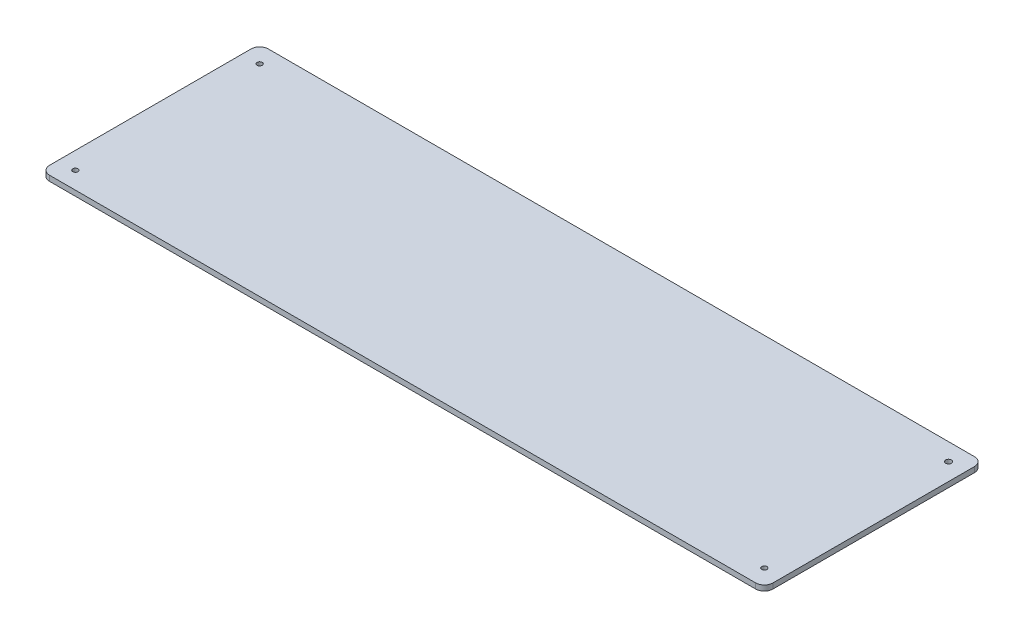
ISO-10303-21;
HEADER;
FILE_DESCRIPTION(('STEP AP214'),'2;1');
FILE_NAME('part.step','',(''),(''),'','','');
FILE_SCHEMA(('AUTOMOTIVE_DESIGN { 1 0 10303 214 1 1 1 1 }'));
ENDSEC;
DATA;
#1=APPLICATION_CONTEXT('core data for automotive mechanical design processes');
#2=APPLICATION_PROTOCOL_DEFINITION('international standard','automotive_design',2000,#1);
#3=PRODUCT_CONTEXT('',#1,'mechanical');
#4=PRODUCT('Part','Part','',(#3));
#5=PRODUCT_RELATED_PRODUCT_CATEGORY('part','',(#4));
#6=PRODUCT_DEFINITION_FORMATION('','',#4);
#7=PRODUCT_DEFINITION_CONTEXT('part definition',#1,'design');
#8=PRODUCT_DEFINITION('design','',#6,#7);
#9=PRODUCT_DEFINITION_SHAPE('','',#8);
#10=(LENGTH_UNIT() NAMED_UNIT(*) SI_UNIT(.MILLI.,.METRE.));
#11=(NAMED_UNIT(*) PLANE_ANGLE_UNIT() SI_UNIT($,.RADIAN.));
#12=(NAMED_UNIT(*) SI_UNIT($,.STERADIAN.) SOLID_ANGLE_UNIT());
#13=UNCERTAINTY_MEASURE_WITH_UNIT(LENGTH_MEASURE(1.E-05),#10,'distance_accuracy_value','');
#14=(GEOMETRIC_REPRESENTATION_CONTEXT(3) GLOBAL_UNCERTAINTY_ASSIGNED_CONTEXT((#13)) GLOBAL_UNIT_ASSIGNED_CONTEXT((#10,
#11,#12)) REPRESENTATION_CONTEXT('',''));
#15=CARTESIAN_POINT('',(0.,0.,0.));
#16=DIRECTION('',(0.,0.,1.));
#17=DIRECTION('',(1.,0.,0.));
#18=AXIS2_PLACEMENT_3D('',#15,#16,#17);
#19=CARTESIAN_POINT('',(210.,3.1,63.5));
#20=DIRECTION('',(-1.,0.,0.));
#21=DIRECTION('',(0.,0.,1.));
#22=AXIS2_PLACEMENT_3D('',#19,#20,#21);
#23=PLANE('',#22);
#24=DIRECTION('',(0.,0.,-1.));
#25=VECTOR('',#24,1.);
#26=CARTESIAN_POINT('',(210.,0.,63.5));
#27=LINE('',#26,#25);
#28=CARTESIAN_POINT('',(210.,0.,58.5));
#29=VERTEX_POINT('',#28);
#30=CARTESIAN_POINT('',(210.,0.,-58.5));
#31=VERTEX_POINT('',#30);
#32=EDGE_CURVE('E127',#29,#31,#27,.T.);
#33=ORIENTED_EDGE('',*,*,#32,.T.);
#34=DIRECTION('',(0.,-1.,0.));
#35=VECTOR('',#34,1.);
#36=CARTESIAN_POINT('',(210.,3.1,-58.5));
#37=LINE('',#36,#35);
#38=CARTESIAN_POINT('',(210.,3.1,-58.5));
#39=VERTEX_POINT('',#38);
#40=EDGE_CURVE('E104',#31,#39,#37,.F.);
#41=ORIENTED_EDGE('',*,*,#40,.T.);
#42=DIRECTION('',(0.,0.,-1.));
#43=VECTOR('',#42,1.);
#44=CARTESIAN_POINT('',(210.,3.1,63.5));
#45=LINE('',#44,#43);
#46=CARTESIAN_POINT('',(210.,3.1,58.5));
#47=VERTEX_POINT('',#46);
#48=EDGE_CURVE('E137',#47,#39,#45,.T.);
#49=ORIENTED_EDGE('',*,*,#48,.F.);
#50=DIRECTION('',(0.,-1.,0.));
#51=VECTOR('',#50,1.);
#52=CARTESIAN_POINT('',(210.,3.1,58.5));
#53=LINE('',#52,#51);
#54=EDGE_CURVE('E109',#47,#29,#53,.T.);
#55=ORIENTED_EDGE('',*,*,#54,.T.);
#56=EDGE_LOOP('',(#33,#41,#49,#55));
#57=FACE_BOUND('',#56,.T.);
#58=ADVANCED_FACE('F32',(#57),#23,.F.);
#59=CARTESIAN_POINT('',(-210.,3.1,-63.5));
#60=DIRECTION('',(0.,0.,1.));
#61=DIRECTION('',(1.,0.,0.));
#62=AXIS2_PLACEMENT_3D('',#59,#60,#61);
#63=PLANE('',#62);
#64=DIRECTION('',(-1.,0.,0.));
#65=VECTOR('',#64,1.);
#66=CARTESIAN_POINT('',(-210.,3.1,-63.5));
#67=LINE('',#66,#65);
#68=CARTESIAN_POINT('',(205.,3.1,-63.5));
#69=VERTEX_POINT('',#68);
#70=CARTESIAN_POINT('',(-205.,3.1,-63.5));
#71=VERTEX_POINT('',#70);
#72=EDGE_CURVE('E119',#69,#71,#67,.T.);
#73=ORIENTED_EDGE('',*,*,#72,.F.);
#74=DIRECTION('',(0.,-1.,0.));
#75=VECTOR('',#74,1.);
#76=CARTESIAN_POINT('',(205.,3.1,-63.5));
#77=LINE('',#76,#75);
#78=CARTESIAN_POINT('',(205.,0.,-63.5));
#79=VERTEX_POINT('',#78);
#80=EDGE_CURVE('E103',#69,#79,#77,.T.);
#81=ORIENTED_EDGE('',*,*,#80,.T.);
#82=DIRECTION('',(-1.,0.,0.));
#83=VECTOR('',#82,1.);
#84=CARTESIAN_POINT('',(-210.,0.,-63.5));
#85=LINE('',#84,#83);
#86=CARTESIAN_POINT('',(-205.,0.,-63.5));
#87=VERTEX_POINT('',#86);
#88=EDGE_CURVE('E116',#79,#87,#85,.T.);
#89=ORIENTED_EDGE('',*,*,#88,.T.);
#90=DIRECTION('',(0.,-1.,0.));
#91=VECTOR('',#90,1.);
#92=CARTESIAN_POINT('',(-205.,3.1,-63.5));
#93=LINE('',#92,#91);
#94=EDGE_CURVE('E121',#87,#71,#93,.F.);
#95=ORIENTED_EDGE('',*,*,#94,.T.);
#96=EDGE_LOOP('',(#73,#81,#89,#95));
#97=FACE_BOUND('',#96,.T.);
#98=ADVANCED_FACE('F115',(#97),#63,.F.);
#99=CARTESIAN_POINT('',(-210.,3.1,63.5));
#100=DIRECTION('',(1.,0.,0.));
#101=DIRECTION('',(0.,0.,-1.));
#102=AXIS2_PLACEMENT_3D('',#99,#100,#101);
#103=PLANE('',#102);
#104=DIRECTION('',(0.,0.,1.));
#105=VECTOR('',#104,1.);
#106=CARTESIAN_POINT('',(-210.,3.1,63.5));
#107=LINE('',#106,#105);
#108=CARTESIAN_POINT('',(-210.,3.1,-58.5));
#109=VERTEX_POINT('',#108);
#110=CARTESIAN_POINT('',(-210.,3.1,58.5));
#111=VERTEX_POINT('',#110);
#112=EDGE_CURVE('E160',#109,#111,#107,.T.);
#113=ORIENTED_EDGE('',*,*,#112,.F.);
#114=DIRECTION('',(0.,-1.,0.));
#115=VECTOR('',#114,1.);
#116=CARTESIAN_POINT('',(-210.,3.1,-58.5));
#117=LINE('',#116,#115);
#118=CARTESIAN_POINT('',(-210.,0.,-58.5));
#119=VERTEX_POINT('',#118);
#120=EDGE_CURVE('E11',#109,#119,#117,.T.);
#121=ORIENTED_EDGE('',*,*,#120,.T.);
#122=DIRECTION('',(0.,0.,1.));
#123=VECTOR('',#122,1.);
#124=CARTESIAN_POINT('',(-210.,0.,63.5));
#125=LINE('',#124,#123);
#126=CARTESIAN_POINT('',(-210.,0.,58.5));
#127=VERTEX_POINT('',#126);
#128=EDGE_CURVE('E126',#119,#127,#125,.T.);
#129=ORIENTED_EDGE('',*,*,#128,.T.);
#130=DIRECTION('',(0.,-1.,0.));
#131=VECTOR('',#130,1.);
#132=CARTESIAN_POINT('',(-210.,3.1,58.5));
#133=LINE('',#132,#131);
#134=EDGE_CURVE('E40',#127,#111,#133,.F.);
#135=ORIENTED_EDGE('',*,*,#134,.T.);
#136=EDGE_LOOP('',(#113,#121,#129,#135));
#137=FACE_BOUND('',#136,.T.);
#138=ADVANCED_FACE('F159',(#137),#103,.F.);
#139=CARTESIAN_POINT('',(-210.,3.1,63.5));
#140=DIRECTION('',(0.,0.,-1.));
#141=DIRECTION('',(-1.,0.,0.));
#142=AXIS2_PLACEMENT_3D('',#139,#140,#141);
#143=PLANE('',#142);
#144=DIRECTION('',(1.,0.,0.));
#145=VECTOR('',#144,1.);
#146=CARTESIAN_POINT('',(-210.,0.,63.5));
#147=LINE('',#146,#145);
#148=CARTESIAN_POINT('',(-205.,0.,63.5));
#149=VERTEX_POINT('',#148);
#150=CARTESIAN_POINT('',(205.,0.,63.5));
#151=VERTEX_POINT('',#150);
#152=EDGE_CURVE('E130',#149,#151,#147,.T.);
#153=ORIENTED_EDGE('',*,*,#152,.T.);
#154=DIRECTION('',(0.,-1.,0.));
#155=VECTOR('',#154,1.);
#156=CARTESIAN_POINT('',(205.,3.1,63.5));
#157=LINE('',#156,#155);
#158=CARTESIAN_POINT('',(205.,3.1,63.5));
#159=VERTEX_POINT('',#158);
#160=EDGE_CURVE('E47',#151,#159,#157,.F.);
#161=ORIENTED_EDGE('',*,*,#160,.T.);
#162=DIRECTION('',(1.,0.,0.));
#163=VECTOR('',#162,1.);
#164=CARTESIAN_POINT('',(-210.,3.1,63.5));
#165=LINE('',#164,#163);
#166=CARTESIAN_POINT('',(-205.,3.1,63.5));
#167=VERTEX_POINT('',#166);
#168=EDGE_CURVE('E138',#167,#159,#165,.T.);
#169=ORIENTED_EDGE('',*,*,#168,.F.);
#170=DIRECTION('',(0.,-1.,0.));
#171=VECTOR('',#170,1.);
#172=CARTESIAN_POINT('',(-205.,3.1,63.5));
#173=LINE('',#172,#171);
#174=EDGE_CURVE('E153',#167,#149,#173,.T.);
#175=ORIENTED_EDGE('',*,*,#174,.T.);
#176=EDGE_LOOP('',(#153,#161,#169,#175));
#177=FACE_BOUND('',#176,.T.);
#178=ADVANCED_FACE('F169',(#177),#143,.F.);
#179=CARTESIAN_POINT('',(0.,3.1,0.));
#180=DIRECTION('',(0.,-1.,0.));
#181=DIRECTION('',(0.,0.,-1.));
#182=AXIS2_PLACEMENT_3D('',#179,#180,#181);
#183=PLANE('',#182);
#184=CARTESIAN_POINT('',(-200.,3.1,53.5));
#185=DIRECTION('',(0.,1.,0.));
#186=DIRECTION('',(0.,0.,1.));
#187=AXIS2_PLACEMENT_3D('',#184,#185,#186);
#188=CIRCLE('',#187,1.5);
#189=CARTESIAN_POINT('',(-200.,3.1,55.));
#190=VERTEX_POINT('',#189);
#191=EDGE_CURVE('E197',#190,#190,#188,.T.);
#192=ORIENTED_EDGE('',*,*,#191,.F.);
#193=EDGE_LOOP('',(#192));
#194=FACE_BOUND('',#193,.T.);
#195=CARTESIAN_POINT('',(200.,3.1,-53.5));
#196=DIRECTION('',(0.,1.,0.));
#197=DIRECTION('',(0.,0.,1.));
#198=AXIS2_PLACEMENT_3D('',#195,#196,#197);
#199=CIRCLE('',#198,1.68611487966267);
#200=CARTESIAN_POINT('',(200.,3.1,-51.8138851203373));
#201=VERTEX_POINT('',#200);
#202=EDGE_CURVE('E191',#201,#201,#199,.T.);
#203=ORIENTED_EDGE('',*,*,#202,.F.);
#204=EDGE_LOOP('',(#203));
#205=FACE_BOUND('',#204,.T.);
#206=CARTESIAN_POINT('',(200.,3.1,53.5));
#207=DIRECTION('',(0.,1.,0.));
#208=DIRECTION('',(0.,0.,1.));
#209=AXIS2_PLACEMENT_3D('',#206,#207,#208);
#210=CIRCLE('',#209,1.5);
#211=CARTESIAN_POINT('',(200.,3.1,55.));
#212=VERTEX_POINT('',#211);
#213=EDGE_CURVE('E185',#212,#212,#210,.T.);
#214=ORIENTED_EDGE('',*,*,#213,.F.);
#215=EDGE_LOOP('',(#214));
#216=FACE_BOUND('',#215,.T.);
#217=CARTESIAN_POINT('',(-200.,3.1,-53.5));
#218=DIRECTION('',(0.,1.,0.));
#219=DIRECTION('',(0.,0.,1.));
#220=AXIS2_PLACEMENT_3D('',#217,#218,#219);
#221=CIRCLE('',#220,1.5);
#222=CARTESIAN_POINT('',(-200.,3.1,-52.));
#223=VERTEX_POINT('',#222);
#224=EDGE_CURVE('E179',#223,#223,#221,.T.);
#225=ORIENTED_EDGE('',*,*,#224,.F.);
#226=EDGE_LOOP('',(#225));
#227=FACE_BOUND('',#226,.T.);
#228=ORIENTED_EDGE('',*,*,#48,.T.);
#229=CARTESIAN_POINT('',(205.,3.1,-58.5));
#230=DIRECTION('',(0.,-1.,0.));
#231=DIRECTION('',(0.,0.,-1.));
#232=AXIS2_PLACEMENT_3D('',#229,#230,#231);
#233=CIRCLE('',#232,5.);
#234=EDGE_CURVE('E151',#39,#69,#233,.F.);
#235=ORIENTED_EDGE('',*,*,#234,.T.);
#236=ORIENTED_EDGE('',*,*,#72,.T.);
#237=CARTESIAN_POINT('',(-205.,3.1,-58.5));
#238=DIRECTION('',(0.,-1.,0.));
#239=DIRECTION('',(0.,0.,-1.));
#240=AXIS2_PLACEMENT_3D('',#237,#238,#239);
#241=CIRCLE('',#240,5.);
#242=EDGE_CURVE('E147',#71,#109,#241,.F.);
#243=ORIENTED_EDGE('',*,*,#242,.T.);
#244=ORIENTED_EDGE('',*,*,#112,.T.);
#245=CARTESIAN_POINT('',(-205.,3.1,58.5));
#246=DIRECTION('',(0.,-1.,0.));
#247=DIRECTION('',(0.,0.,-1.));
#248=AXIS2_PLACEMENT_3D('',#245,#246,#247);
#249=CIRCLE('',#248,5.);
#250=EDGE_CURVE('E54',#111,#167,#249,.F.);
#251=ORIENTED_EDGE('',*,*,#250,.T.);
#252=ORIENTED_EDGE('',*,*,#168,.T.);
#253=CARTESIAN_POINT('',(205.,3.1,58.5));
#254=DIRECTION('',(0.,-1.,0.));
#255=DIRECTION('',(0.,0.,-1.));
#256=AXIS2_PLACEMENT_3D('',#253,#254,#255);
#257=CIRCLE('',#256,5.);
#258=EDGE_CURVE('E149',#159,#47,#257,.F.);
#259=ORIENTED_EDGE('',*,*,#258,.T.);
#260=EDGE_LOOP('',(#228,#235,#236,#243,#244,#251,#252,#259));
#261=FACE_BOUND('',#260,.T.);
#262=ADVANCED_FACE('F164',(#194,#205,#216,#227,#261),#183,.F.);
#263=CARTESIAN_POINT('',(0.,0.,0.));
#264=DIRECTION('',(0.,-1.,0.));
#265=DIRECTION('',(0.,0.,-1.));
#266=AXIS2_PLACEMENT_3D('',#263,#264,#265);
#267=PLANE('',#266);
#268=CARTESIAN_POINT('',(-200.,0.,53.5));
#269=DIRECTION('',(0.,1.,0.));
#270=DIRECTION('',(0.,0.,1.));
#271=AXIS2_PLACEMENT_3D('',#268,#269,#270);
#272=CIRCLE('',#271,1.5);
#273=CARTESIAN_POINT('',(-200.,0.,55.));
#274=VERTEX_POINT('',#273);
#275=EDGE_CURVE('E182',#274,#274,#272,.T.);
#276=ORIENTED_EDGE('',*,*,#275,.T.);
#277=EDGE_LOOP('',(#276));
#278=FACE_BOUND('',#277,.T.);
#279=CARTESIAN_POINT('',(200.,0.,-53.5));
#280=DIRECTION('',(0.,1.,0.));
#281=DIRECTION('',(0.,0.,1.));
#282=AXIS2_PLACEMENT_3D('',#279,#280,#281);
#283=CIRCLE('',#282,1.68611487966267);
#284=CARTESIAN_POINT('',(200.,0.,-51.8138851203373));
#285=VERTEX_POINT('',#284);
#286=EDGE_CURVE('E194',#285,#285,#283,.T.);
#287=ORIENTED_EDGE('',*,*,#286,.T.);
#288=EDGE_LOOP('',(#287));
#289=FACE_BOUND('',#288,.T.);
#290=CARTESIAN_POINT('',(200.,0.,53.5));
#291=DIRECTION('',(0.,1.,0.));
#292=DIRECTION('',(0.,0.,1.));
#293=AXIS2_PLACEMENT_3D('',#290,#291,#292);
#294=CIRCLE('',#293,1.5);
#295=CARTESIAN_POINT('',(200.,0.,55.));
#296=VERTEX_POINT('',#295);
#297=EDGE_CURVE('E188',#296,#296,#294,.T.);
#298=ORIENTED_EDGE('',*,*,#297,.T.);
#299=EDGE_LOOP('',(#298));
#300=FACE_BOUND('',#299,.T.);
#301=CARTESIAN_POINT('',(-200.,0.,-53.5));
#302=DIRECTION('',(0.,1.,0.));
#303=DIRECTION('',(0.,0.,1.));
#304=AXIS2_PLACEMENT_3D('',#301,#302,#303);
#305=CIRCLE('',#304,1.5);
#306=CARTESIAN_POINT('',(-200.,0.,-52.));
#307=VERTEX_POINT('',#306);
#308=EDGE_CURVE('E132',#307,#307,#305,.T.);
#309=ORIENTED_EDGE('',*,*,#308,.T.);
#310=EDGE_LOOP('',(#309));
#311=FACE_BOUND('',#310,.T.);
#312=ORIENTED_EDGE('',*,*,#88,.F.);
#313=CARTESIAN_POINT('',(205.,0.,-58.5));
#314=DIRECTION('',(0.,-1.,0.));
#315=DIRECTION('',(0.,0.,-1.));
#316=AXIS2_PLACEMENT_3D('',#313,#314,#315);
#317=CIRCLE('',#316,5.);
#318=EDGE_CURVE('E99',#79,#31,#317,.T.);
#319=ORIENTED_EDGE('',*,*,#318,.T.);
#320=ORIENTED_EDGE('',*,*,#32,.F.);
#321=CARTESIAN_POINT('',(205.,0.,58.5));
#322=DIRECTION('',(0.,-1.,0.));
#323=DIRECTION('',(0.,0.,-1.));
#324=AXIS2_PLACEMENT_3D('',#321,#322,#323);
#325=CIRCLE('',#324,5.);
#326=EDGE_CURVE('E110',#29,#151,#325,.T.);
#327=ORIENTED_EDGE('',*,*,#326,.T.);
#328=ORIENTED_EDGE('',*,*,#152,.F.);
#329=CARTESIAN_POINT('',(-205.,0.,58.5));
#330=DIRECTION('',(0.,-1.,0.));
#331=DIRECTION('',(0.,0.,-1.));
#332=AXIS2_PLACEMENT_3D('',#329,#330,#331);
#333=CIRCLE('',#332,5.);
#334=EDGE_CURVE('E120',#149,#127,#333,.T.);
#335=ORIENTED_EDGE('',*,*,#334,.T.);
#336=ORIENTED_EDGE('',*,*,#128,.F.);
#337=CARTESIAN_POINT('',(-205.,0.,-58.5));
#338=DIRECTION('',(0.,-1.,0.));
#339=DIRECTION('',(0.,0.,-1.));
#340=AXIS2_PLACEMENT_3D('',#337,#338,#339);
#341=CIRCLE('',#340,5.);
#342=EDGE_CURVE('E125',#119,#87,#341,.T.);
#343=ORIENTED_EDGE('',*,*,#342,.T.);
#344=EDGE_LOOP('',(#312,#319,#320,#327,#328,#335,#336,#343));
#345=FACE_BOUND('',#344,.T.);
#346=ADVANCED_FACE('F123',(#278,#289,#300,#311,#345),#267,.T.);
#347=CARTESIAN_POINT('',(205.,3.1,-58.5));
#348=DIRECTION('',(0.,-1.,0.));
#349=DIRECTION('',(0.,0.,-1.));
#350=AXIS2_PLACEMENT_3D('',#347,#348,#349);
#351=CYLINDRICAL_SURFACE('',#350,5.);
#352=ORIENTED_EDGE('',*,*,#234,.F.);
#353=ORIENTED_EDGE('',*,*,#40,.F.);
#354=ORIENTED_EDGE('',*,*,#318,.F.);
#355=ORIENTED_EDGE('',*,*,#80,.F.);
#356=EDGE_LOOP('',(#352,#353,#354,#355));
#357=FACE_BOUND('',#356,.T.);
#358=ADVANCED_FACE('F102',(#357),#351,.T.);
#359=CARTESIAN_POINT('',(205.,3.1,58.5));
#360=DIRECTION('',(0.,-1.,0.));
#361=DIRECTION('',(0.,0.,-1.));
#362=AXIS2_PLACEMENT_3D('',#359,#360,#361);
#363=CYLINDRICAL_SURFACE('',#362,5.);
#364=ORIENTED_EDGE('',*,*,#258,.F.);
#365=ORIENTED_EDGE('',*,*,#160,.F.);
#366=ORIENTED_EDGE('',*,*,#326,.F.);
#367=ORIENTED_EDGE('',*,*,#54,.F.);
#368=EDGE_LOOP('',(#364,#365,#366,#367));
#369=FACE_BOUND('',#368,.T.);
#370=ADVANCED_FACE('F173',(#369),#363,.T.);
#371=CARTESIAN_POINT('',(-205.,3.1,-58.5));
#372=DIRECTION('',(0.,-1.,0.));
#373=DIRECTION('',(0.,0.,-1.));
#374=AXIS2_PLACEMENT_3D('',#371,#372,#373);
#375=CYLINDRICAL_SURFACE('',#374,5.);
#376=ORIENTED_EDGE('',*,*,#242,.F.);
#377=ORIENTED_EDGE('',*,*,#94,.F.);
#378=ORIENTED_EDGE('',*,*,#342,.F.);
#379=ORIENTED_EDGE('',*,*,#120,.F.);
#380=EDGE_LOOP('',(#376,#377,#378,#379));
#381=FACE_BOUND('',#380,.T.);
#382=ADVANCED_FACE('F232',(#381),#375,.T.);
#383=CARTESIAN_POINT('',(-205.,3.1,58.5));
#384=DIRECTION('',(0.,-1.,0.));
#385=DIRECTION('',(0.,0.,-1.));
#386=AXIS2_PLACEMENT_3D('',#383,#384,#385);
#387=CYLINDRICAL_SURFACE('',#386,5.);
#388=ORIENTED_EDGE('',*,*,#250,.F.);
#389=ORIENTED_EDGE('',*,*,#134,.F.);
#390=ORIENTED_EDGE('',*,*,#334,.F.);
#391=ORIENTED_EDGE('',*,*,#174,.F.);
#392=EDGE_LOOP('',(#388,#389,#390,#391));
#393=FACE_BOUND('',#392,.T.);
#394=ADVANCED_FACE('F34',(#393),#387,.T.);
#395=CARTESIAN_POINT('',(-200.,0.,-53.5));
#396=DIRECTION('',(0.,1.,0.));
#397=DIRECTION('',(0.,0.,1.));
#398=AXIS2_PLACEMENT_3D('',#395,#396,#397);
#399=CYLINDRICAL_SURFACE('',#398,1.5);
#400=CARTESIAN_POINT('',(-200.,0.,-52.));
#401=CARTESIAN_POINT('',(-200.,0.0322916666666666,-52.));
#402=CARTESIAN_POINT('',(-200.,0.0645833333333333,-52.));
#403=CARTESIAN_POINT('',(-200.,0.129166666666667,-52.));
#404=CARTESIAN_POINT('',(-200.,0.161458333333333,-52.));
#405=CARTESIAN_POINT('',(-200.,0.226041666666667,-52.));
#406=CARTESIAN_POINT('',(-200.,0.258333333333333,-52.));
#407=CARTESIAN_POINT('',(-200.,0.322916666666667,-52.));
#408=CARTESIAN_POINT('',(-200.,0.355208333333333,-52.));
#409=CARTESIAN_POINT('',(-200.,0.419791666666667,-52.));
#410=CARTESIAN_POINT('',(-200.,0.452083333333333,-52.));
#411=CARTESIAN_POINT('',(-200.,0.516666666666667,-52.));
#412=CARTESIAN_POINT('',(-200.,0.548958333333333,-52.));
#413=CARTESIAN_POINT('',(-200.,0.613541666666667,-52.));
#414=CARTESIAN_POINT('',(-200.,0.645833333333333,-52.));
#415=CARTESIAN_POINT('',(-200.,0.710416666666667,-52.));
#416=CARTESIAN_POINT('',(-200.,0.742708333333333,-52.));
#417=CARTESIAN_POINT('',(-200.,0.807291666666667,-52.));
#418=CARTESIAN_POINT('',(-200.,0.839583333333333,-52.));
#419=CARTESIAN_POINT('',(-200.,0.904166666666667,-52.));
#420=CARTESIAN_POINT('',(-200.,0.936458333333333,-52.));
#421=CARTESIAN_POINT('',(-200.,1.00104166666667,-52.));
#422=CARTESIAN_POINT('',(-200.,1.03333333333333,-52.));
#423=CARTESIAN_POINT('',(-200.,1.09791666666667,-52.));
#424=CARTESIAN_POINT('',(-200.,1.13020833333333,-52.));
#425=CARTESIAN_POINT('',(-200.,1.19479166666667,-52.));
#426=CARTESIAN_POINT('',(-200.,1.22708333333333,-52.));
#427=CARTESIAN_POINT('',(-200.,1.29166666666667,-52.));
#428=CARTESIAN_POINT('',(-200.,1.32395833333333,-52.));
#429=CARTESIAN_POINT('',(-200.,1.38854166666667,-52.));
#430=CARTESIAN_POINT('',(-200.,1.42083333333333,-52.));
#431=CARTESIAN_POINT('',(-200.,1.48541666666667,-52.));
#432=CARTESIAN_POINT('',(-200.,1.51770833333333,-52.));
#433=CARTESIAN_POINT('',(-200.,1.58229166666667,-52.));
#434=CARTESIAN_POINT('',(-200.,1.61458333333333,-52.));
#435=CARTESIAN_POINT('',(-200.,1.67916666666667,-52.));
#436=CARTESIAN_POINT('',(-200.,1.71145833333333,-52.));
#437=CARTESIAN_POINT('',(-200.,1.77604166666667,-52.));
#438=CARTESIAN_POINT('',(-200.,1.80833333333333,-52.));
#439=CARTESIAN_POINT('',(-200.,1.87291666666667,-52.));
#440=CARTESIAN_POINT('',(-200.,1.90520833333333,-52.));
#441=CARTESIAN_POINT('',(-200.,1.96979166666667,-52.));
#442=CARTESIAN_POINT('',(-200.,2.00208333333333,-52.));
#443=CARTESIAN_POINT('',(-200.,2.06666666666667,-52.));
#444=CARTESIAN_POINT('',(-200.,2.09895833333333,-52.));
#445=CARTESIAN_POINT('',(-200.,2.16354166666667,-52.));
#446=CARTESIAN_POINT('',(-200.,2.19583333333333,-52.));
#447=CARTESIAN_POINT('',(-200.,2.26041666666667,-52.));
#448=CARTESIAN_POINT('',(-200.,2.29270833333333,-52.));
#449=CARTESIAN_POINT('',(-200.,2.35729166666667,-52.));
#450=CARTESIAN_POINT('',(-200.,2.38958333333333,-52.));
#451=CARTESIAN_POINT('',(-200.,2.45416666666667,-52.));
#452=CARTESIAN_POINT('',(-200.,2.48645833333333,-52.));
#453=CARTESIAN_POINT('',(-200.,2.55104166666667,-52.));
#454=CARTESIAN_POINT('',(-200.,2.58333333333333,-52.));
#455=CARTESIAN_POINT('',(-200.,2.64791666666667,-52.));
#456=CARTESIAN_POINT('',(-200.,2.68020833333333,-52.));
#457=CARTESIAN_POINT('',(-200.,2.74479166666667,-52.));
#458=CARTESIAN_POINT('',(-200.,2.77708333333333,-52.));
#459=CARTESIAN_POINT('',(-200.,2.84166666666667,-52.));
#460=CARTESIAN_POINT('',(-200.,2.87395833333333,-52.));
#461=CARTESIAN_POINT('',(-200.,2.93854166666667,-52.));
#462=CARTESIAN_POINT('',(-200.,2.97083333333333,-52.));
#463=CARTESIAN_POINT('',(-200.,3.03541666666667,-52.));
#464=CARTESIAN_POINT('',(-200.,3.06770833333333,-52.));
#465=CARTESIAN_POINT('',(-200.,3.1,-52.));
#466=B_SPLINE_CURVE_WITH_KNOTS('',3,(#400,#401,#402,#403,#404,#405,#406,#407,#408,#409,#410,
#411,#412,#413,#414,#415,#416,#417,#418,#419,#420,#421,#422,#423,#424,#425,#426,#427,#428,#429,
#430,#431,#432,#433,#434,#435,#436,#437,#438,#439,#440,#441,#442,#443,#444,#445,#446,#447,#448,
#449,#450,#451,#452,#453,#454,#455,#456,#457,#458,#459,#460,#461,#462,#463,#464,#465),
.UNSPECIFIED.,.F.,.F.,(4,2,2,2,2,2,2,2,2,2,2,2,2,2,2,2,2,2,2,2,2,2,2,2,2,2,2,2,2,2,2,2,4),(0.,
0.096875,0.19375,0.290625,0.3875,0.484375,0.58125,0.678125,0.775,0.871875,0.96875,1.065625,
1.1625,1.259375,1.35625,1.453125,1.55,1.646875,1.74375,1.840625,1.9375,2.034375,2.13125,
2.228125,2.325,2.421875,2.51875,2.615625,2.7125,2.809375,2.90625,3.003125,3.1),.UNSPECIFIED.);
#467=EDGE_CURVE('BSEAM221',#307,#223,#466,.T.);
#468=ORIENTED_EDGE('',*,*,#308,.F.);
#469=ORIENTED_EDGE('',*,*,#224,.T.);
#470=ORIENTED_EDGE('',*,*,#467,.T.);
#471=ORIENTED_EDGE('',*,*,#467,.F.);
#472=EDGE_LOOP('',(#468,#470,#469,#471));
#473=FACE_BOUND('',#472,.T.);
#474=ADVANCED_FACE('F221',(#473),#399,.F.);
#475=CARTESIAN_POINT('',(200.,0.,53.5));
#476=DIRECTION('',(0.,1.,0.));
#477=DIRECTION('',(0.,0.,1.));
#478=AXIS2_PLACEMENT_3D('',#475,#476,#477);
#479=CYLINDRICAL_SURFACE('',#478,1.5);
#480=CARTESIAN_POINT('',(200.,0.,55.));
#481=CARTESIAN_POINT('',(200.,0.0322916666666666,55.));
#482=CARTESIAN_POINT('',(200.,0.0645833333333333,55.));
#483=CARTESIAN_POINT('',(200.,0.129166666666667,55.));
#484=CARTESIAN_POINT('',(200.,0.161458333333333,55.));
#485=CARTESIAN_POINT('',(200.,0.226041666666667,55.));
#486=CARTESIAN_POINT('',(200.,0.258333333333333,55.));
#487=CARTESIAN_POINT('',(200.,0.322916666666667,55.));
#488=CARTESIAN_POINT('',(200.,0.355208333333333,55.));
#489=CARTESIAN_POINT('',(200.,0.419791666666667,55.));
#490=CARTESIAN_POINT('',(200.,0.452083333333333,55.));
#491=CARTESIAN_POINT('',(200.,0.516666666666667,55.));
#492=CARTESIAN_POINT('',(200.,0.548958333333333,55.));
#493=CARTESIAN_POINT('',(200.,0.613541666666667,55.));
#494=CARTESIAN_POINT('',(200.,0.645833333333333,55.));
#495=CARTESIAN_POINT('',(200.,0.710416666666667,55.));
#496=CARTESIAN_POINT('',(200.,0.742708333333333,55.));
#497=CARTESIAN_POINT('',(200.,0.807291666666667,55.));
#498=CARTESIAN_POINT('',(200.,0.839583333333333,55.));
#499=CARTESIAN_POINT('',(200.,0.904166666666667,55.));
#500=CARTESIAN_POINT('',(200.,0.936458333333333,55.));
#501=CARTESIAN_POINT('',(200.,1.00104166666667,55.));
#502=CARTESIAN_POINT('',(200.,1.03333333333333,55.));
#503=CARTESIAN_POINT('',(200.,1.09791666666667,55.));
#504=CARTESIAN_POINT('',(200.,1.13020833333333,55.));
#505=CARTESIAN_POINT('',(200.,1.19479166666667,55.));
#506=CARTESIAN_POINT('',(200.,1.22708333333333,55.));
#507=CARTESIAN_POINT('',(200.,1.29166666666667,55.));
#508=CARTESIAN_POINT('',(200.,1.32395833333333,55.));
#509=CARTESIAN_POINT('',(200.,1.38854166666667,55.));
#510=CARTESIAN_POINT('',(200.,1.42083333333333,55.));
#511=CARTESIAN_POINT('',(200.,1.48541666666667,55.));
#512=CARTESIAN_POINT('',(200.,1.51770833333333,55.));
#513=CARTESIAN_POINT('',(200.,1.58229166666667,55.));
#514=CARTESIAN_POINT('',(200.,1.61458333333333,55.));
#515=CARTESIAN_POINT('',(200.,1.67916666666667,55.));
#516=CARTESIAN_POINT('',(200.,1.71145833333333,55.));
#517=CARTESIAN_POINT('',(200.,1.77604166666667,55.));
#518=CARTESIAN_POINT('',(200.,1.80833333333333,55.));
#519=CARTESIAN_POINT('',(200.,1.87291666666667,55.));
#520=CARTESIAN_POINT('',(200.,1.90520833333333,55.));
#521=CARTESIAN_POINT('',(200.,1.96979166666667,55.));
#522=CARTESIAN_POINT('',(200.,2.00208333333333,55.));
#523=CARTESIAN_POINT('',(200.,2.06666666666667,55.));
#524=CARTESIAN_POINT('',(200.,2.09895833333333,55.));
#525=CARTESIAN_POINT('',(200.,2.16354166666667,55.));
#526=CARTESIAN_POINT('',(200.,2.19583333333333,55.));
#527=CARTESIAN_POINT('',(200.,2.26041666666667,55.));
#528=CARTESIAN_POINT('',(200.,2.29270833333333,55.));
#529=CARTESIAN_POINT('',(200.,2.35729166666667,55.));
#530=CARTESIAN_POINT('',(200.,2.38958333333333,55.));
#531=CARTESIAN_POINT('',(200.,2.45416666666667,55.));
#532=CARTESIAN_POINT('',(200.,2.48645833333333,55.));
#533=CARTESIAN_POINT('',(200.,2.55104166666667,55.));
#534=CARTESIAN_POINT('',(200.,2.58333333333333,55.));
#535=CARTESIAN_POINT('',(200.,2.64791666666667,55.));
#536=CARTESIAN_POINT('',(200.,2.68020833333333,55.));
#537=CARTESIAN_POINT('',(200.,2.74479166666667,55.));
#538=CARTESIAN_POINT('',(200.,2.77708333333333,55.));
#539=CARTESIAN_POINT('',(200.,2.84166666666667,55.));
#540=CARTESIAN_POINT('',(200.,2.87395833333333,55.));
#541=CARTESIAN_POINT('',(200.,2.93854166666667,55.));
#542=CARTESIAN_POINT('',(200.,2.97083333333333,55.));
#543=CARTESIAN_POINT('',(200.,3.03541666666667,55.));
#544=CARTESIAN_POINT('',(200.,3.06770833333333,55.));
#545=CARTESIAN_POINT('',(200.,3.1,55.));
#546=B_SPLINE_CURVE_WITH_KNOTS('',3,(#480,#481,#482,#483,#484,#485,#486,#487,#488,#489,#490,
#491,#492,#493,#494,#495,#496,#497,#498,#499,#500,#501,#502,#503,#504,#505,#506,#507,#508,#509,
#510,#511,#512,#513,#514,#515,#516,#517,#518,#519,#520,#521,#522,#523,#524,#525,#526,#527,#528,
#529,#530,#531,#532,#533,#534,#535,#536,#537,#538,#539,#540,#541,#542,#543,#544,#545),
.UNSPECIFIED.,.F.,.F.,(4,2,2,2,2,2,2,2,2,2,2,2,2,2,2,2,2,2,2,2,2,2,2,2,2,2,2,2,2,2,2,2,4),(0.,
0.096875,0.19375,0.290625,0.3875,0.484375,0.58125,0.678125,0.775,0.871875,0.96875,1.065625,
1.1625,1.259375,1.35625,1.453125,1.55,1.646875,1.74375,1.840625,1.9375,2.034375,2.13125,
2.228125,2.325,2.421875,2.51875,2.615625,2.7125,2.809375,2.90625,3.003125,3.1),.UNSPECIFIED.);
#547=EDGE_CURVE('BSEAM223',#296,#212,#546,.T.);
#548=ORIENTED_EDGE('',*,*,#297,.F.);
#549=ORIENTED_EDGE('',*,*,#213,.T.);
#550=ORIENTED_EDGE('',*,*,#547,.T.);
#551=ORIENTED_EDGE('',*,*,#547,.F.);
#552=EDGE_LOOP('',(#548,#550,#549,#551));
#553=FACE_BOUND('',#552,.T.);
#554=ADVANCED_FACE('F223',(#553),#479,.F.);
#555=CARTESIAN_POINT('',(200.,0.,-53.5));
#556=DIRECTION('',(0.,1.,0.));
#557=DIRECTION('',(0.,0.,1.));
#558=AXIS2_PLACEMENT_3D('',#555,#556,#557);
#559=CYLINDRICAL_SURFACE('',#558,1.68611487966267);
#560=CARTESIAN_POINT('',(200.,0.,-51.8138851203373));
#561=CARTESIAN_POINT('',(200.,0.0322916666666666,-51.8138851203373));
#562=CARTESIAN_POINT('',(200.,0.0645833333333333,-51.8138851203373));
#563=CARTESIAN_POINT('',(200.,0.129166666666667,-51.8138851203373));
#564=CARTESIAN_POINT('',(200.,0.161458333333333,-51.8138851203373));
#565=CARTESIAN_POINT('',(200.,0.226041666666667,-51.8138851203373));
#566=CARTESIAN_POINT('',(200.,0.258333333333333,-51.8138851203373));
#567=CARTESIAN_POINT('',(200.,0.322916666666667,-51.8138851203373));
#568=CARTESIAN_POINT('',(200.,0.355208333333333,-51.8138851203373));
#569=CARTESIAN_POINT('',(200.,0.419791666666667,-51.8138851203373));
#570=CARTESIAN_POINT('',(200.,0.452083333333333,-51.8138851203373));
#571=CARTESIAN_POINT('',(200.,0.516666666666667,-51.8138851203373));
#572=CARTESIAN_POINT('',(200.,0.548958333333333,-51.8138851203373));
#573=CARTESIAN_POINT('',(200.,0.613541666666667,-51.8138851203373));
#574=CARTESIAN_POINT('',(200.,0.645833333333333,-51.8138851203373));
#575=CARTESIAN_POINT('',(200.,0.710416666666667,-51.8138851203373));
#576=CARTESIAN_POINT('',(200.,0.742708333333333,-51.8138851203373));
#577=CARTESIAN_POINT('',(200.,0.807291666666667,-51.8138851203373));
#578=CARTESIAN_POINT('',(200.,0.839583333333333,-51.8138851203373));
#579=CARTESIAN_POINT('',(200.,0.904166666666667,-51.8138851203373));
#580=CARTESIAN_POINT('',(200.,0.936458333333333,-51.8138851203373));
#581=CARTESIAN_POINT('',(200.,1.00104166666667,-51.8138851203373));
#582=CARTESIAN_POINT('',(200.,1.03333333333333,-51.8138851203373));
#583=CARTESIAN_POINT('',(200.,1.09791666666667,-51.8138851203373));
#584=CARTESIAN_POINT('',(200.,1.13020833333333,-51.8138851203373));
#585=CARTESIAN_POINT('',(200.,1.19479166666667,-51.8138851203373));
#586=CARTESIAN_POINT('',(200.,1.22708333333333,-51.8138851203373));
#587=CARTESIAN_POINT('',(200.,1.29166666666667,-51.8138851203373));
#588=CARTESIAN_POINT('',(200.,1.32395833333333,-51.8138851203373));
#589=CARTESIAN_POINT('',(200.,1.38854166666667,-51.8138851203373));
#590=CARTESIAN_POINT('',(200.,1.42083333333333,-51.8138851203373));
#591=CARTESIAN_POINT('',(200.,1.48541666666667,-51.8138851203373));
#592=CARTESIAN_POINT('',(200.,1.51770833333333,-51.8138851203373));
#593=CARTESIAN_POINT('',(200.,1.58229166666667,-51.8138851203373));
#594=CARTESIAN_POINT('',(200.,1.61458333333333,-51.8138851203373));
#595=CARTESIAN_POINT('',(200.,1.67916666666667,-51.8138851203373));
#596=CARTESIAN_POINT('',(200.,1.71145833333333,-51.8138851203373));
#597=CARTESIAN_POINT('',(200.,1.77604166666667,-51.8138851203373));
#598=CARTESIAN_POINT('',(200.,1.80833333333333,-51.8138851203373));
#599=CARTESIAN_POINT('',(200.,1.87291666666667,-51.8138851203373));
#600=CARTESIAN_POINT('',(200.,1.90520833333333,-51.8138851203373));
#601=CARTESIAN_POINT('',(200.,1.96979166666667,-51.8138851203373));
#602=CARTESIAN_POINT('',(200.,2.00208333333333,-51.8138851203373));
#603=CARTESIAN_POINT('',(200.,2.06666666666667,-51.8138851203373));
#604=CARTESIAN_POINT('',(200.,2.09895833333333,-51.8138851203373));
#605=CARTESIAN_POINT('',(200.,2.16354166666667,-51.8138851203373));
#606=CARTESIAN_POINT('',(200.,2.19583333333333,-51.8138851203373));
#607=CARTESIAN_POINT('',(200.,2.26041666666667,-51.8138851203373));
#608=CARTESIAN_POINT('',(200.,2.29270833333333,-51.8138851203373));
#609=CARTESIAN_POINT('',(200.,2.35729166666667,-51.8138851203373));
#610=CARTESIAN_POINT('',(200.,2.38958333333333,-51.8138851203373));
#611=CARTESIAN_POINT('',(200.,2.45416666666667,-51.8138851203373));
#612=CARTESIAN_POINT('',(200.,2.48645833333333,-51.8138851203373));
#613=CARTESIAN_POINT('',(200.,2.55104166666667,-51.8138851203373));
#614=CARTESIAN_POINT('',(200.,2.58333333333333,-51.8138851203373));
#615=CARTESIAN_POINT('',(200.,2.64791666666667,-51.8138851203373));
#616=CARTESIAN_POINT('',(200.,2.68020833333333,-51.8138851203373));
#617=CARTESIAN_POINT('',(200.,2.74479166666667,-51.8138851203373));
#618=CARTESIAN_POINT('',(200.,2.77708333333333,-51.8138851203373));
#619=CARTESIAN_POINT('',(200.,2.84166666666667,-51.8138851203373));
#620=CARTESIAN_POINT('',(200.,2.87395833333333,-51.8138851203373));
#621=CARTESIAN_POINT('',(200.,2.93854166666667,-51.8138851203373));
#622=CARTESIAN_POINT('',(200.,2.97083333333333,-51.8138851203373));
#623=CARTESIAN_POINT('',(200.,3.03541666666667,-51.8138851203373));
#624=CARTESIAN_POINT('',(200.,3.06770833333333,-51.8138851203373));
#625=CARTESIAN_POINT('',(200.,3.1,-51.8138851203373));
#626=B_SPLINE_CURVE_WITH_KNOTS('',3,(#560,#561,#562,#563,#564,#565,#566,#567,#568,#569,#570,
#571,#572,#573,#574,#575,#576,#577,#578,#579,#580,#581,#582,#583,#584,#585,#586,#587,#588,#589,
#590,#591,#592,#593,#594,#595,#596,#597,#598,#599,#600,#601,#602,#603,#604,#605,#606,#607,#608,
#609,#610,#611,#612,#613,#614,#615,#616,#617,#618,#619,#620,#621,#622,#623,#624,#625),
.UNSPECIFIED.,.F.,.F.,(4,2,2,2,2,2,2,2,2,2,2,2,2,2,2,2,2,2,2,2,2,2,2,2,2,2,2,2,2,2,2,2,4),(0.,
0.096875,0.19375,0.290625,0.3875,0.484375,0.58125,0.678125,0.775,0.871875,0.96875,1.065625,
1.1625,1.259375,1.35625,1.453125,1.55,1.646875,1.74375,1.840625,1.9375,2.034375,2.13125,
2.228125,2.325,2.421875,2.51875,2.615625,2.7125,2.809375,2.90625,3.003125,3.1),.UNSPECIFIED.);
#627=EDGE_CURVE('BSEAM208',#285,#201,#626,.T.);
#628=ORIENTED_EDGE('',*,*,#286,.F.);
#629=ORIENTED_EDGE('',*,*,#202,.T.);
#630=ORIENTED_EDGE('',*,*,#627,.T.);
#631=ORIENTED_EDGE('',*,*,#627,.F.);
#632=EDGE_LOOP('',(#628,#630,#629,#631));
#633=FACE_BOUND('',#632,.T.);
#634=ADVANCED_FACE('F208',(#633),#559,.F.);
#635=CARTESIAN_POINT('',(-200.,0.,53.5));
#636=DIRECTION('',(0.,1.,0.));
#637=DIRECTION('',(0.,0.,1.));
#638=AXIS2_PLACEMENT_3D('',#635,#636,#637);
#639=CYLINDRICAL_SURFACE('',#638,1.5);
#640=CARTESIAN_POINT('',(-200.,0.,55.));
#641=CARTESIAN_POINT('',(-200.,0.0322916666666666,55.));
#642=CARTESIAN_POINT('',(-200.,0.0645833333333333,55.));
#643=CARTESIAN_POINT('',(-200.,0.129166666666667,55.));
#644=CARTESIAN_POINT('',(-200.,0.161458333333333,55.));
#645=CARTESIAN_POINT('',(-200.,0.226041666666667,55.));
#646=CARTESIAN_POINT('',(-200.,0.258333333333333,55.));
#647=CARTESIAN_POINT('',(-200.,0.322916666666667,55.));
#648=CARTESIAN_POINT('',(-200.,0.355208333333333,55.));
#649=CARTESIAN_POINT('',(-200.,0.419791666666667,55.));
#650=CARTESIAN_POINT('',(-200.,0.452083333333333,55.));
#651=CARTESIAN_POINT('',(-200.,0.516666666666667,55.));
#652=CARTESIAN_POINT('',(-200.,0.548958333333333,55.));
#653=CARTESIAN_POINT('',(-200.,0.613541666666667,55.));
#654=CARTESIAN_POINT('',(-200.,0.645833333333333,55.));
#655=CARTESIAN_POINT('',(-200.,0.710416666666667,55.));
#656=CARTESIAN_POINT('',(-200.,0.742708333333333,55.));
#657=CARTESIAN_POINT('',(-200.,0.807291666666667,55.));
#658=CARTESIAN_POINT('',(-200.,0.839583333333333,55.));
#659=CARTESIAN_POINT('',(-200.,0.904166666666667,55.));
#660=CARTESIAN_POINT('',(-200.,0.936458333333333,55.));
#661=CARTESIAN_POINT('',(-200.,1.00104166666667,55.));
#662=CARTESIAN_POINT('',(-200.,1.03333333333333,55.));
#663=CARTESIAN_POINT('',(-200.,1.09791666666667,55.));
#664=CARTESIAN_POINT('',(-200.,1.13020833333333,55.));
#665=CARTESIAN_POINT('',(-200.,1.19479166666667,55.));
#666=CARTESIAN_POINT('',(-200.,1.22708333333333,55.));
#667=CARTESIAN_POINT('',(-200.,1.29166666666667,55.));
#668=CARTESIAN_POINT('',(-200.,1.32395833333333,55.));
#669=CARTESIAN_POINT('',(-200.,1.38854166666667,55.));
#670=CARTESIAN_POINT('',(-200.,1.42083333333333,55.));
#671=CARTESIAN_POINT('',(-200.,1.48541666666667,55.));
#672=CARTESIAN_POINT('',(-200.,1.51770833333333,55.));
#673=CARTESIAN_POINT('',(-200.,1.58229166666667,55.));
#674=CARTESIAN_POINT('',(-200.,1.61458333333333,55.));
#675=CARTESIAN_POINT('',(-200.,1.67916666666667,55.));
#676=CARTESIAN_POINT('',(-200.,1.71145833333333,55.));
#677=CARTESIAN_POINT('',(-200.,1.77604166666667,55.));
#678=CARTESIAN_POINT('',(-200.,1.80833333333333,55.));
#679=CARTESIAN_POINT('',(-200.,1.87291666666667,55.));
#680=CARTESIAN_POINT('',(-200.,1.90520833333333,55.));
#681=CARTESIAN_POINT('',(-200.,1.96979166666667,55.));
#682=CARTESIAN_POINT('',(-200.,2.00208333333333,55.));
#683=CARTESIAN_POINT('',(-200.,2.06666666666667,55.));
#684=CARTESIAN_POINT('',(-200.,2.09895833333333,55.));
#685=CARTESIAN_POINT('',(-200.,2.16354166666667,55.));
#686=CARTESIAN_POINT('',(-200.,2.19583333333333,55.));
#687=CARTESIAN_POINT('',(-200.,2.26041666666667,55.));
#688=CARTESIAN_POINT('',(-200.,2.29270833333333,55.));
#689=CARTESIAN_POINT('',(-200.,2.35729166666667,55.));
#690=CARTESIAN_POINT('',(-200.,2.38958333333333,55.));
#691=CARTESIAN_POINT('',(-200.,2.45416666666667,55.));
#692=CARTESIAN_POINT('',(-200.,2.48645833333333,55.));
#693=CARTESIAN_POINT('',(-200.,2.55104166666667,55.));
#694=CARTESIAN_POINT('',(-200.,2.58333333333333,55.));
#695=CARTESIAN_POINT('',(-200.,2.64791666666667,55.));
#696=CARTESIAN_POINT('',(-200.,2.68020833333333,55.));
#697=CARTESIAN_POINT('',(-200.,2.74479166666667,55.));
#698=CARTESIAN_POINT('',(-200.,2.77708333333333,55.));
#699=CARTESIAN_POINT('',(-200.,2.84166666666667,55.));
#700=CARTESIAN_POINT('',(-200.,2.87395833333333,55.));
#701=CARTESIAN_POINT('',(-200.,2.93854166666667,55.));
#702=CARTESIAN_POINT('',(-200.,2.97083333333333,55.));
#703=CARTESIAN_POINT('',(-200.,3.03541666666667,55.));
#704=CARTESIAN_POINT('',(-200.,3.06770833333333,55.));
#705=CARTESIAN_POINT('',(-200.,3.1,55.));
#706=B_SPLINE_CURVE_WITH_KNOTS('',3,(#640,#641,#642,#643,#644,#645,#646,#647,#648,#649,#650,
#651,#652,#653,#654,#655,#656,#657,#658,#659,#660,#661,#662,#663,#664,#665,#666,#667,#668,#669,
#670,#671,#672,#673,#674,#675,#676,#677,#678,#679,#680,#681,#682,#683,#684,#685,#686,#687,#688,
#689,#690,#691,#692,#693,#694,#695,#696,#697,#698,#699,#700,#701,#702,#703,#704,#705),
.UNSPECIFIED.,.F.,.F.,(4,2,2,2,2,2,2,2,2,2,2,2,2,2,2,2,2,2,2,2,2,2,2,2,2,2,2,2,2,2,2,2,4),(0.,
0.096875,0.19375,0.290625,0.3875,0.484375,0.58125,0.678125,0.775,0.871875,0.96875,1.065625,
1.1625,1.259375,1.35625,1.453125,1.55,1.646875,1.74375,1.840625,1.9375,2.034375,2.13125,
2.228125,2.325,2.421875,2.51875,2.615625,2.7125,2.809375,2.90625,3.003125,3.1),.UNSPECIFIED.);
#707=EDGE_CURVE('BSEAM205',#274,#190,#706,.T.);
#708=ORIENTED_EDGE('',*,*,#275,.F.);
#709=ORIENTED_EDGE('',*,*,#191,.T.);
#710=ORIENTED_EDGE('',*,*,#707,.T.);
#711=ORIENTED_EDGE('',*,*,#707,.F.);
#712=EDGE_LOOP('',(#708,#710,#709,#711));
#713=FACE_BOUND('',#712,.T.);
#714=ADVANCED_FACE('F205',(#713),#639,.F.);
#715=CLOSED_SHELL('',(#58,#98,#138,#178,#262,#346,#358,#370,#382,#394,#474,#554,#634,#714));
#716=MANIFOLD_SOLID_BREP('B2',#715);
#717=ADVANCED_BREP_SHAPE_REPRESENTATION('',(#18,#716),#14);
#718=SHAPE_DEFINITION_REPRESENTATION(#9,#717);
ENDSEC;
END-ISO-10303-21;
